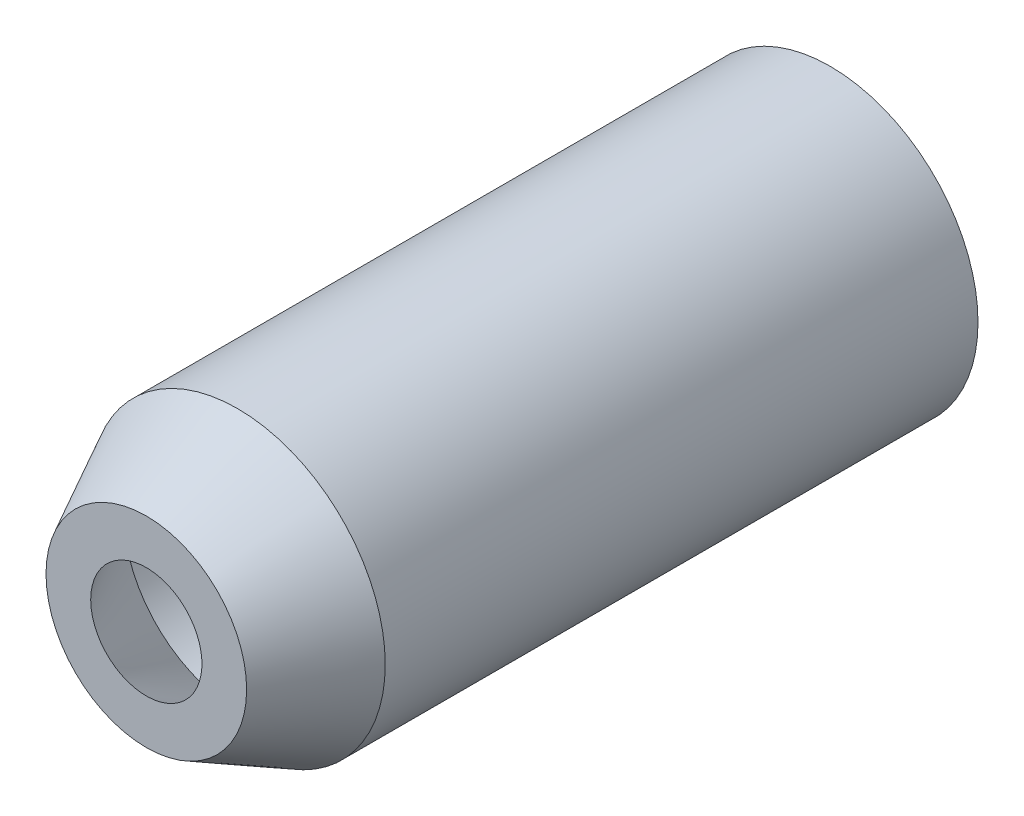
ISO-10303-21;
HEADER;
FILE_DESCRIPTION(('STEP AP214'),'2;1');
FILE_NAME('part.step','',(''),(''),'','','');
FILE_SCHEMA(('AUTOMOTIVE_DESIGN { 1 0 10303 214 1 1 1 1 }'));
ENDSEC;
DATA;
#1=APPLICATION_CONTEXT('core data for automotive mechanical design processes');
#2=APPLICATION_PROTOCOL_DEFINITION('international standard','automotive_design',2000,#1);
#3=PRODUCT_CONTEXT('',#1,'mechanical');
#4=PRODUCT('Part','Part','',(#3));
#5=PRODUCT_RELATED_PRODUCT_CATEGORY('part','',(#4));
#6=PRODUCT_DEFINITION_FORMATION('','',#4);
#7=PRODUCT_DEFINITION_CONTEXT('part definition',#1,'design');
#8=PRODUCT_DEFINITION('design','',#6,#7);
#9=PRODUCT_DEFINITION_SHAPE('','',#8);
#10=(LENGTH_UNIT() NAMED_UNIT(*) SI_UNIT(.MILLI.,.METRE.));
#11=(NAMED_UNIT(*) PLANE_ANGLE_UNIT() SI_UNIT($,.RADIAN.));
#12=(NAMED_UNIT(*) SI_UNIT($,.STERADIAN.) SOLID_ANGLE_UNIT());
#13=UNCERTAINTY_MEASURE_WITH_UNIT(LENGTH_MEASURE(1.E-05),#10,'distance_accuracy_value','');
#14=(GEOMETRIC_REPRESENTATION_CONTEXT(3) GLOBAL_UNCERTAINTY_ASSIGNED_CONTEXT((#13)) GLOBAL_UNIT_ASSIGNED_CONTEXT((#10,
#11,#12)) REPRESENTATION_CONTEXT('',''));
#15=CARTESIAN_POINT('',(0.,0.,0.));
#16=DIRECTION('',(0.,0.,1.));
#17=DIRECTION('',(1.,0.,0.));
#18=AXIS2_PLACEMENT_3D('',#15,#16,#17);
#19=CARTESIAN_POINT('',(0.,0.,0.));
#20=DIRECTION('',(0.,0.,1.));
#21=DIRECTION('',(1.,0.,0.));
#22=AXIS2_PLACEMENT_3D('',#19,#20,#21);
#23=PLANE('',#22);
#24=CARTESIAN_POINT('',(0.,0.,0.));
#25=DIRECTION('',(0.,0.,1.));
#26=DIRECTION('',(1.,0.,0.));
#27=AXIS2_PLACEMENT_3D('',#24,#25,#26);
#28=CIRCLE('',#27,32.4);
#29=CARTESIAN_POINT('',(32.4,0.,0.));
#30=VERTEX_POINT('',#29);
#31=EDGE_CURVE('E47',#30,#30,#28,.T.);
#32=ORIENTED_EDGE('',*,*,#31,.F.);
#33=EDGE_LOOP('',(#32));
#34=FACE_BOUND('',#33,.T.);
#35=CARTESIAN_POINT('',(0.,0.,0.));
#36=DIRECTION('',(0.,0.,1.));
#37=DIRECTION('',(1.,0.,0.));
#38=AXIS2_PLACEMENT_3D('',#35,#36,#37);
#39=CIRCLE('',#38,25.);
#40=CARTESIAN_POINT('',(25.,0.,0.));
#41=VERTEX_POINT('',#40);
#42=EDGE_CURVE('E56',#41,#41,#39,.T.);
#43=ORIENTED_EDGE('',*,*,#42,.T.);
#44=EDGE_LOOP('',(#43));
#45=FACE_BOUND('',#44,.T.);
#46=ADVANCED_FACE('F43',(#34,#45),#23,.F.);
#47=CARTESIAN_POINT('',(0.,0.,130.));
#48=DIRECTION('',(0.,0.,-1.));
#49=DIRECTION('',(-1.,0.,0.));
#50=AXIS2_PLACEMENT_3D('',#47,#48,#49);
#51=CYLINDRICAL_SURFACE('',#50,32.4);
#52=CARTESIAN_POINT('',(0.,0.,130.));
#53=DIRECTION('',(0.,0.,1.));
#54=DIRECTION('',(1.,0.,0.));
#55=AXIS2_PLACEMENT_3D('',#52,#53,#54);
#56=CIRCLE('',#55,32.4);
#57=CARTESIAN_POINT('',(32.4,0.,130.));
#58=VERTEX_POINT('',#57);
#59=EDGE_CURVE('E10',#58,#58,#56,.T.);
#60=ORIENTED_EDGE('',*,*,#59,.F.);
#61=EDGE_LOOP('',(#60));
#62=FACE_BOUND('',#61,.T.);
#63=ORIENTED_EDGE('',*,*,#31,.T.);
#64=EDGE_LOOP('',(#63));
#65=FACE_BOUND('',#64,.T.);
#66=ADVANCED_FACE('F45',(#62,#65),#51,.T.);
#67=CARTESIAN_POINT('',(0.,0.,130.));
#68=DIRECTION('',(0.,0.,-1.));
#69=DIRECTION('',(-1.,0.,0.));
#70=AXIS2_PLACEMENT_3D('',#67,#68,#69);
#71=CYLINDRICAL_SURFACE('',#70,25.);
#72=CARTESIAN_POINT('',(0.,0.,130.));
#73=DIRECTION('',(0.,0.,-1.));
#74=DIRECTION('',(-1.,0.,0.));
#75=AXIS2_PLACEMENT_3D('',#72,#73,#74);
#76=CIRCLE('',#75,25.);
#77=CARTESIAN_POINT('',(-25.,0.,130.));
#78=VERTEX_POINT('',#77);
#79=EDGE_CURVE('E69',#78,#78,#76,.T.);
#80=ORIENTED_EDGE('',*,*,#79,.F.);
#81=EDGE_LOOP('',(#80));
#82=FACE_BOUND('',#81,.T.);
#83=ORIENTED_EDGE('',*,*,#42,.F.);
#84=EDGE_LOOP('',(#83));
#85=FACE_BOUND('',#84,.T.);
#86=ADVANCED_FACE('F77',(#82,#85),#71,.F.);
#87=CARTESIAN_POINT('',(0.,0.,130.));
#88=DIRECTION('',(0.,0.,-1.));
#89=DIRECTION('',(-1.,0.,0.));
#90=AXIS2_PLACEMENT_3D('',#87,#88,#89);
#91=CONICAL_SURFACE('',#90,32.4,0.479519291992596);
#92=CARTESIAN_POINT('',(0.,0.,150.));
#93=DIRECTION('',(0.,0.,-1.));
#94=DIRECTION('',(-1.,0.,0.));
#95=AXIS2_PLACEMENT_3D('',#92,#93,#94);
#96=CIRCLE('',#95,22.);
#97=CARTESIAN_POINT('',(-22.,0.,150.));
#98=VERTEX_POINT('',#97);
#99=EDGE_CURVE('E61',#98,#98,#96,.T.);
#100=ORIENTED_EDGE('',*,*,#99,.T.);
#101=EDGE_LOOP('',(#100));
#102=FACE_BOUND('',#101,.T.);
#103=ORIENTED_EDGE('',*,*,#59,.T.);
#104=EDGE_LOOP('',(#103));
#105=FACE_BOUND('',#104,.T.);
#106=ADVANCED_FACE('F80',(#102,#105),#91,.T.);
#107=CARTESIAN_POINT('',(0.,12.2,150.));
#108=DIRECTION('',(0.,0.,1.));
#109=DIRECTION('',(1.,0.,0.));
#110=AXIS2_PLACEMENT_3D('',#107,#108,#109);
#111=PLANE('',#110);
#112=CARTESIAN_POINT('',(0.,0.,150.));
#113=DIRECTION('',(0.,0.,-1.));
#114=DIRECTION('',(-1.,0.,0.));
#115=AXIS2_PLACEMENT_3D('',#112,#113,#114);
#116=CIRCLE('',#115,12.2);
#117=CARTESIAN_POINT('',(-12.2,0.,150.));
#118=VERTEX_POINT('',#117);
#119=EDGE_CURVE('E65',#118,#118,#116,.T.);
#120=ORIENTED_EDGE('',*,*,#119,.T.);
#121=EDGE_LOOP('',(#120));
#122=FACE_BOUND('',#121,.T.);
#123=ORIENTED_EDGE('',*,*,#99,.F.);
#124=EDGE_LOOP('',(#123));
#125=FACE_BOUND('',#124,.T.);
#126=ADVANCED_FACE('F94',(#122,#125),#111,.T.);
#127=CARTESIAN_POINT('',(0.,0.,150.));
#128=DIRECTION('',(0.,0.,-1.));
#129=DIRECTION('',(-1.,0.,0.));
#130=AXIS2_PLACEMENT_3D('',#127,#128,#129);
#131=CONICAL_SURFACE('',#130,12.2,0.569313191100662);
#132=ORIENTED_EDGE('',*,*,#79,.T.);
#133=EDGE_LOOP('',(#132));
#134=FACE_BOUND('',#133,.T.);
#135=ORIENTED_EDGE('',*,*,#119,.F.);
#136=EDGE_LOOP('',(#135));
#137=FACE_BOUND('',#136,.T.);
#138=ADVANCED_FACE('F74',(#134,#137),#131,.F.);
#139=CLOSED_SHELL('',(#46,#66,#86,#106,#126,#138));
#140=MANIFOLD_SOLID_BREP('B2',#139);
#141=ADVANCED_BREP_SHAPE_REPRESENTATION('',(#18,#140),#14);
#142=SHAPE_DEFINITION_REPRESENTATION(#9,#141);
ENDSEC;
END-ISO-10303-21;
